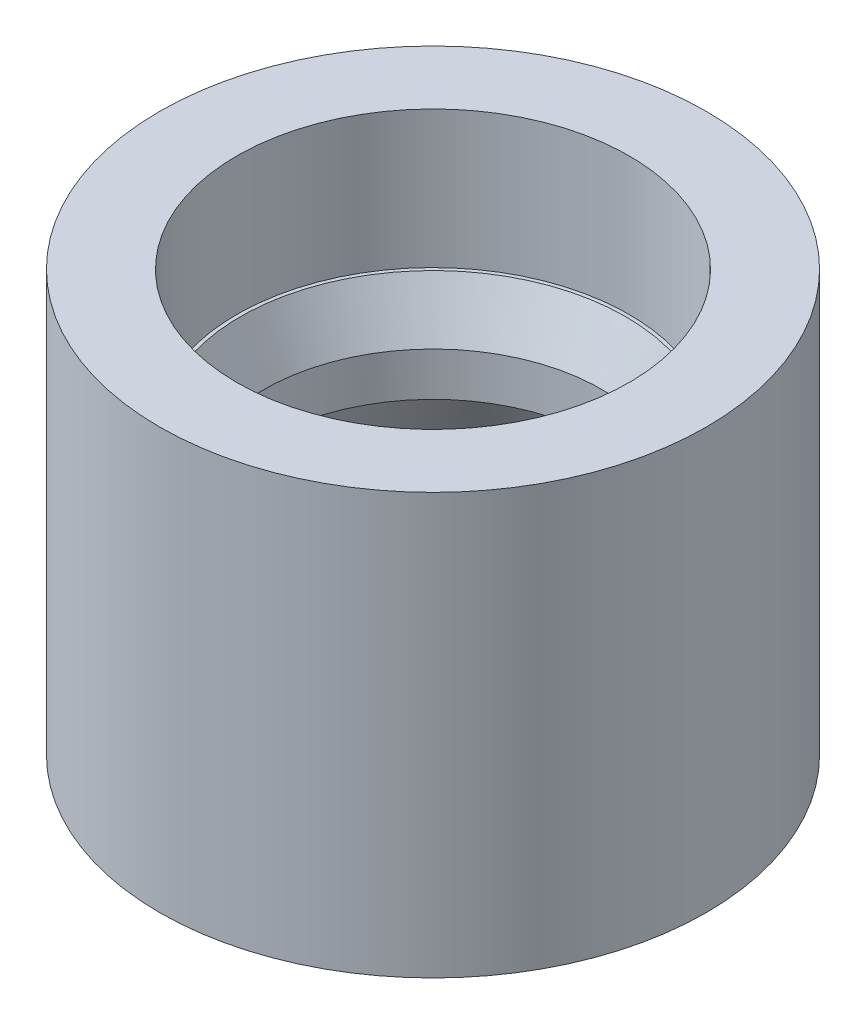
ISO-10303-21;
HEADER;
FILE_DESCRIPTION(('STEP AP214'),'2;1');
FILE_NAME('part.step','',(''),(''),'','','');
FILE_SCHEMA(('AUTOMOTIVE_DESIGN { 1 0 10303 214 1 1 1 1 }'));
ENDSEC;
DATA;
#1=APPLICATION_CONTEXT('core data for automotive mechanical design processes');
#2=APPLICATION_PROTOCOL_DEFINITION('international standard','automotive_design',2000,#1);
#3=PRODUCT_CONTEXT('',#1,'mechanical');
#4=PRODUCT('Part','Part','',(#3));
#5=PRODUCT_RELATED_PRODUCT_CATEGORY('part','',(#4));
#6=PRODUCT_DEFINITION_FORMATION('','',#4);
#7=PRODUCT_DEFINITION_CONTEXT('part definition',#1,'design');
#8=PRODUCT_DEFINITION('design','',#6,#7);
#9=PRODUCT_DEFINITION_SHAPE('','',#8);
#10=(LENGTH_UNIT() NAMED_UNIT(*) SI_UNIT(.MILLI.,.METRE.));
#11=(NAMED_UNIT(*) PLANE_ANGLE_UNIT() SI_UNIT($,.RADIAN.));
#12=(NAMED_UNIT(*) SI_UNIT($,.STERADIAN.) SOLID_ANGLE_UNIT());
#13=UNCERTAINTY_MEASURE_WITH_UNIT(LENGTH_MEASURE(1.E-05),#10,'distance_accuracy_value','');
#14=(GEOMETRIC_REPRESENTATION_CONTEXT(3) GLOBAL_UNCERTAINTY_ASSIGNED_CONTEXT((#13)) GLOBAL_UNIT_ASSIGNED_CONTEXT((#10,
#11,#12)) REPRESENTATION_CONTEXT('',''));
#15=CARTESIAN_POINT('',(0.,0.,0.));
#16=DIRECTION('',(0.,0.,1.));
#17=DIRECTION('',(1.,0.,0.));
#18=AXIS2_PLACEMENT_3D('',#15,#16,#17);
#19=CARTESIAN_POINT('',(0.,4.9,0.));
#20=DIRECTION('',(0.,-1.,0.));
#21=DIRECTION('',(0.,0.,-1.));
#22=AXIS2_PLACEMENT_3D('',#19,#20,#21);
#23=PLANE('',#22);
#24=CARTESIAN_POINT('',(0.,4.9,0.));
#25=DIRECTION('',(0.,-1.,0.));
#26=DIRECTION('',(0.,0.,-1.));
#27=AXIS2_PLACEMENT_3D('',#24,#25,#26);
#28=CIRCLE('',#27,6.87148709964627);
#29=CARTESIAN_POINT('',(0.,4.9,-6.87148709964627));
#30=VERTEX_POINT('',#29);
#31=EDGE_CURVE('E10',#30,#30,#28,.F.);
#32=ORIENTED_EDGE('',*,*,#31,.T.);
#33=EDGE_LOOP('',(#32));
#34=FACE_BOUND('',#33,.T.);
#35=CARTESIAN_POINT('',(0.,4.9,0.));
#36=DIRECTION('',(0.,-1.,0.));
#37=DIRECTION('',(0.,0.,-1.));
#38=AXIS2_PLACEMENT_3D('',#35,#36,#37);
#39=CIRCLE('',#38,7.);
#40=CARTESIAN_POINT('',(0.,4.9,-7.));
#41=VERTEX_POINT('',#40);
#42=EDGE_CURVE('E66',#41,#41,#39,.T.);
#43=ORIENTED_EDGE('',*,*,#42,.T.);
#44=EDGE_LOOP('',(#43));
#45=FACE_BOUND('',#44,.T.);
#46=ADVANCED_FACE('F39',(#34,#45),#23,.T.);
#47=CARTESIAN_POINT('',(0.,10.1,0.));
#48=DIRECTION('',(0.,1.,0.));
#49=DIRECTION('',(0.,0.,1.));
#50=AXIS2_PLACEMENT_3D('',#47,#48,#49);
#51=PLANE('',#50);
#52=CARTESIAN_POINT('',(0.,10.1,0.));
#53=DIRECTION('',(0.,1.,0.));
#54=DIRECTION('',(0.,0.,1.));
#55=AXIS2_PLACEMENT_3D('',#52,#53,#54);
#56=CIRCLE('',#55,6.87148709964626);
#57=CARTESIAN_POINT('',(0.,10.1,6.87148709964626));
#58=VERTEX_POINT('',#57);
#59=EDGE_CURVE('E48',#58,#58,#56,.F.);
#60=ORIENTED_EDGE('',*,*,#59,.T.);
#61=EDGE_LOOP('',(#60));
#62=FACE_BOUND('',#61,.T.);
#63=CARTESIAN_POINT('',(0.,10.1,0.));
#64=DIRECTION('',(0.,1.,0.));
#65=DIRECTION('',(0.,0.,1.));
#66=AXIS2_PLACEMENT_3D('',#63,#64,#65);
#67=CIRCLE('',#66,7.);
#68=CARTESIAN_POINT('',(0.,10.1,7.));
#69=VERTEX_POINT('',#68);
#70=EDGE_CURVE('E44',#69,#69,#67,.T.);
#71=ORIENTED_EDGE('',*,*,#70,.T.);
#72=EDGE_LOOP('',(#71));
#73=FACE_BOUND('',#72,.T.);
#74=ADVANCED_FACE('F91',(#62,#73),#51,.T.);
#75=CARTESIAN_POINT('',(0.,-0.100000000000001,0.));
#76=DIRECTION('',(0.,1.,0.));
#77=DIRECTION('',(0.,0.,1.));
#78=AXIS2_PLACEMENT_3D('',#75,#76,#77);
#79=CYLINDRICAL_SURFACE('',#78,6.02148709964627);
#80=CARTESIAN_POINT('',(0.,8.2771691175669,0.));
#81=DIRECTION('',(0.,1.,0.));
#82=DIRECTION('',(0.,0.,1.));
#83=AXIS2_PLACEMENT_3D('',#80,#81,#82);
#84=CIRCLE('',#83,6.02148709964627);
#85=CARTESIAN_POINT('',(0.,8.2771691175669,6.02148709964627));
#86=VERTEX_POINT('',#85);
#87=EDGE_CURVE('E52',#86,#86,#84,.T.);
#88=ORIENTED_EDGE('',*,*,#87,.T.);
#89=EDGE_LOOP('',(#88));
#90=FACE_BOUND('',#89,.T.);
#91=CARTESIAN_POINT('',(0.,6.72283088243312,0.));
#92=DIRECTION('',(0.,-1.,0.));
#93=DIRECTION('',(0.,0.,-1.));
#94=AXIS2_PLACEMENT_3D('',#91,#92,#93);
#95=CIRCLE('',#94,6.02148709964627);
#96=CARTESIAN_POINT('',(0.,6.72283088243312,-6.02148709964627));
#97=VERTEX_POINT('',#96);
#98=EDGE_CURVE('E57',#97,#97,#95,.T.);
#99=ORIENTED_EDGE('',*,*,#98,.T.);
#100=EDGE_LOOP('',(#99));
#101=FACE_BOUND('',#100,.T.);
#102=ADVANCED_FACE('F96',(#90,#101),#79,.F.);
#103=CARTESIAN_POINT('',(0.,8.2771691175669,0.));
#104=DIRECTION('',(0.,1.,0.));
#105=DIRECTION('',(0.,0.,1.));
#106=AXIS2_PLACEMENT_3D('',#103,#104,#105);
#107=CONICAL_SURFACE('',#106,6.02148709964627,0.436332312998585);
#108=ORIENTED_EDGE('',*,*,#59,.F.);
#109=EDGE_LOOP('',(#108));
#110=FACE_BOUND('',#109,.T.);
#111=ORIENTED_EDGE('',*,*,#87,.F.);
#112=EDGE_LOOP('',(#111));
#113=FACE_BOUND('',#112,.T.);
#114=ADVANCED_FACE('F103',(#110,#113),#107,.F.);
#115=CARTESIAN_POINT('',(0.,6.72283088243312,0.));
#116=DIRECTION('',(0.,-1.,0.));
#117=DIRECTION('',(0.,0.,-1.));
#118=AXIS2_PLACEMENT_3D('',#115,#116,#117);
#119=CONICAL_SURFACE('',#118,6.02148709964627,0.436332312998583);
#120=ORIENTED_EDGE('',*,*,#31,.F.);
#121=EDGE_LOOP('',(#120));
#122=FACE_BOUND('',#121,.T.);
#123=ORIENTED_EDGE('',*,*,#98,.F.);
#124=EDGE_LOOP('',(#123));
#125=FACE_BOUND('',#124,.T.);
#126=ADVANCED_FACE('F42',(#122,#125),#119,.F.);
#127=CARTESIAN_POINT('',(0.,-27.5771644662754,0.));
#128=DIRECTION('',(0.,1.,0.));
#129=DIRECTION('',(0.,0.,1.));
#130=AXIS2_PLACEMENT_3D('',#127,#128,#129);
#131=CYLINDRICAL_SURFACE('',#130,7.);
#132=ORIENTED_EDGE('',*,*,#70,.F.);
#133=EDGE_LOOP('',(#132));
#134=FACE_BOUND('',#133,.T.);
#135=CARTESIAN_POINT('',(0.,15.,0.));
#136=DIRECTION('',(0.,1.,0.));
#137=DIRECTION('',(0.,0.,1.));
#138=AXIS2_PLACEMENT_3D('',#135,#136,#137);
#139=CIRCLE('',#138,7.);
#140=CARTESIAN_POINT('',(0.,15.,7.));
#141=VERTEX_POINT('',#140);
#142=EDGE_CURVE('E72',#141,#141,#139,.T.);
#143=ORIENTED_EDGE('',*,*,#142,.T.);
#144=EDGE_LOOP('',(#143));
#145=FACE_BOUND('',#144,.T.);
#146=ADVANCED_FACE('F76',(#134,#145),#131,.F.);
#147=ORIENTED_EDGE('',*,*,#42,.F.);
#148=EDGE_LOOP('',(#147));
#149=FACE_BOUND('',#148,.T.);
#150=CARTESIAN_POINT('',(0.,0.,0.));
#151=DIRECTION('',(0.,1.,0.));
#152=DIRECTION('',(0.,0.,1.));
#153=AXIS2_PLACEMENT_3D('',#150,#151,#152);
#154=CIRCLE('',#153,7.);
#155=CARTESIAN_POINT('',(0.,0.,7.));
#156=VERTEX_POINT('',#155);
#157=EDGE_CURVE('E69',#156,#156,#154,.F.);
#158=ORIENTED_EDGE('',*,*,#157,.T.);
#159=EDGE_LOOP('',(#158));
#160=FACE_BOUND('',#159,.T.);
#161=ADVANCED_FACE('F118',(#149,#160),#131,.F.);
#162=CARTESIAN_POINT('',(0.,0.,0.));
#163=DIRECTION('',(0.,1.,0.));
#164=DIRECTION('',(0.,0.,1.));
#165=AXIS2_PLACEMENT_3D('',#162,#163,#164);
#166=PLANE('',#165);
#167=CARTESIAN_POINT('',(0.,0.,0.));
#168=DIRECTION('',(0.,-1.,0.));
#169=DIRECTION('',(0.,0.,-1.));
#170=AXIS2_PLACEMENT_3D('',#167,#168,#169);
#171=CIRCLE('',#170,9.75);
#172=CARTESIAN_POINT('',(0.,0.,-9.75));
#173=VERTEX_POINT('',#172);
#174=EDGE_CURVE('E63',#173,#173,#171,.T.);
#175=ORIENTED_EDGE('',*,*,#174,.T.);
#176=EDGE_LOOP('',(#175));
#177=FACE_BOUND('',#176,.T.);
#178=ORIENTED_EDGE('',*,*,#157,.F.);
#179=EDGE_LOOP('',(#178));
#180=FACE_BOUND('',#179,.T.);
#181=ADVANCED_FACE('F86',(#177,#180),#166,.F.);
#182=CARTESIAN_POINT('',(0.,26.,0.));
#183=DIRECTION('',(0.,-1.,0.));
#184=DIRECTION('',(0.,0.,-1.));
#185=AXIS2_PLACEMENT_3D('',#182,#183,#184);
#186=CYLINDRICAL_SURFACE('',#185,9.75);
#187=CARTESIAN_POINT('',(0.,15.,0.));
#188=DIRECTION('',(0.,1.,0.));
#189=DIRECTION('',(0.,0.,1.));
#190=AXIS2_PLACEMENT_3D('',#187,#188,#189);
#191=CIRCLE('',#190,9.75);
#192=CARTESIAN_POINT('',(0.,15.,9.75));
#193=VERTEX_POINT('',#192);
#194=EDGE_CURVE('E60',#193,#193,#191,.T.);
#195=ORIENTED_EDGE('',*,*,#194,.F.);
#196=EDGE_LOOP('',(#195));
#197=FACE_BOUND('',#196,.T.);
#198=ORIENTED_EDGE('',*,*,#174,.F.);
#199=EDGE_LOOP('',(#198));
#200=FACE_BOUND('',#199,.T.);
#201=ADVANCED_FACE('F80',(#197,#200),#186,.T.);
#202=CARTESIAN_POINT('',(0.,15.,0.));
#203=DIRECTION('',(0.,1.,0.));
#204=DIRECTION('',(0.,0.,1.));
#205=AXIS2_PLACEMENT_3D('',#202,#203,#204);
#206=PLANE('',#205);
#207=ORIENTED_EDGE('',*,*,#194,.T.);
#208=EDGE_LOOP('',(#207));
#209=FACE_BOUND('',#208,.T.);
#210=ORIENTED_EDGE('',*,*,#142,.F.);
#211=EDGE_LOOP('',(#210));
#212=FACE_BOUND('',#211,.T.);
#213=ADVANCED_FACE('F78',(#209,#212),#206,.T.);
#214=CLOSED_SHELL('',(#46,#74,#102,#114,#126,#146,#161,#181,#201,#213));
#215=MANIFOLD_SOLID_BREP('B2',#214);
#216=ADVANCED_BREP_SHAPE_REPRESENTATION('',(#18,#215),#14);
#217=SHAPE_DEFINITION_REPRESENTATION(#9,#216);
ENDSEC;
END-ISO-10303-21;
